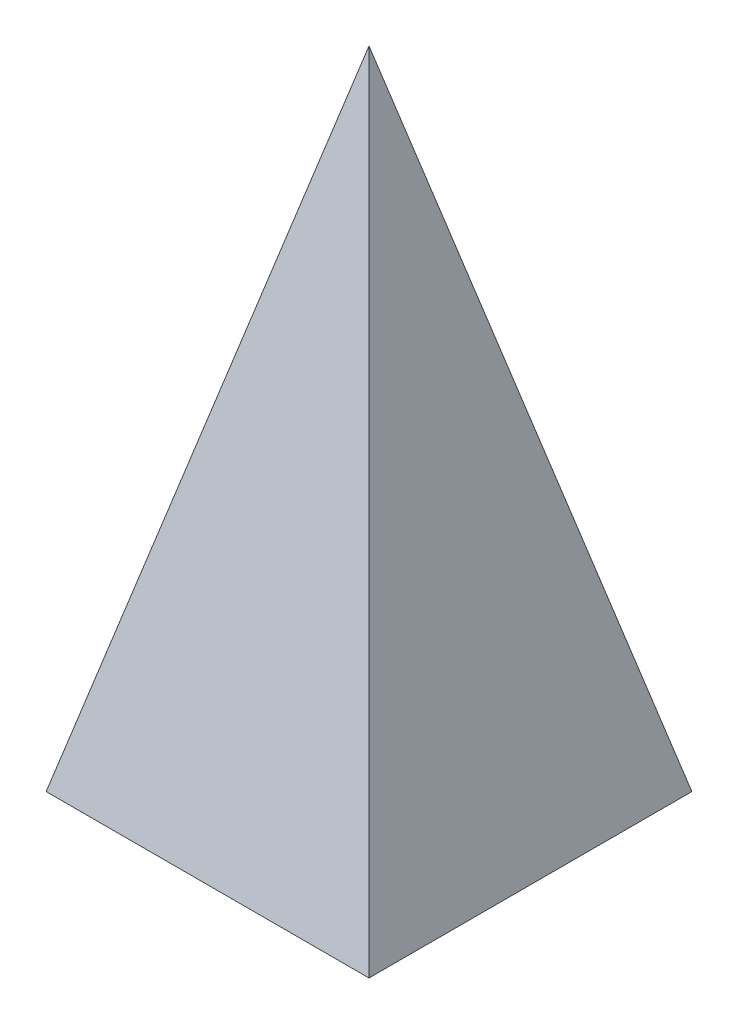
ISO-10303-21;
HEADER;
FILE_DESCRIPTION(('STEP AP214'),'2;1');
FILE_NAME('part.step','',(''),(''),'','','');
FILE_SCHEMA(('AUTOMOTIVE_DESIGN { 1 0 10303 214 1 1 1 1 }'));
ENDSEC;
DATA;
#1=APPLICATION_CONTEXT('core data for automotive mechanical design processes');
#2=APPLICATION_PROTOCOL_DEFINITION('international standard','automotive_design',2000,#1);
#3=PRODUCT_CONTEXT('',#1,'mechanical');
#4=PRODUCT('Part','Part','',(#3));
#5=PRODUCT_RELATED_PRODUCT_CATEGORY('part','',(#4));
#6=PRODUCT_DEFINITION_FORMATION('','',#4);
#7=PRODUCT_DEFINITION_CONTEXT('part definition',#1,'design');
#8=PRODUCT_DEFINITION('design','',#6,#7);
#9=PRODUCT_DEFINITION_SHAPE('','',#8);
#10=(LENGTH_UNIT() NAMED_UNIT(*) SI_UNIT(.MILLI.,.METRE.));
#11=(NAMED_UNIT(*) PLANE_ANGLE_UNIT() SI_UNIT($,.RADIAN.));
#12=(NAMED_UNIT(*) SI_UNIT($,.STERADIAN.) SOLID_ANGLE_UNIT());
#13=UNCERTAINTY_MEASURE_WITH_UNIT(LENGTH_MEASURE(1.E-05),#10,'distance_accuracy_value','');
#14=(GEOMETRIC_REPRESENTATION_CONTEXT(3) GLOBAL_UNCERTAINTY_ASSIGNED_CONTEXT((#13)) GLOBAL_UNIT_ASSIGNED_CONTEXT((#10,
#11,#12)) REPRESENTATION_CONTEXT('',''));
#15=CARTESIAN_POINT('',(0.,0.,0.));
#16=DIRECTION('',(0.,0.,1.));
#17=DIRECTION('',(1.,0.,0.));
#18=AXIS2_PLACEMENT_3D('',#15,#16,#17);
#19=CARTESIAN_POINT('',(0.,0.,0.));
#20=DIRECTION('',(0.,1.,0.));
#21=DIRECTION('',(0.,0.,1.));
#22=AXIS2_PLACEMENT_3D('',#19,#20,#21);
#23=PLANE('',#22);
#24=DIRECTION('',(0.,0.,-1.));
#25=VECTOR('',#24,1.);
#26=CARTESIAN_POINT('',(10.,0.,-10.));
#27=LINE('',#26,#25);
#28=CARTESIAN_POINT('',(10.,0.,10.));
#29=VERTEX_POINT('',#28);
#30=CARTESIAN_POINT('',(10.,0.,-10.));
#31=VERTEX_POINT('',#30);
#32=EDGE_CURVE('E137',#29,#31,#27,.T.);
#33=ORIENTED_EDGE('',*,*,#32,.F.);
#34=DIRECTION('',(1.,0.,0.));
#35=VECTOR('',#34,1.);
#36=CARTESIAN_POINT('',(-10.,0.,10.));
#37=LINE('',#36,#35);
#38=CARTESIAN_POINT('',(-10.,0.,10.));
#39=VERTEX_POINT('',#38);
#40=EDGE_CURVE('E74',#39,#29,#37,.T.);
#41=ORIENTED_EDGE('',*,*,#40,.F.);
#42=DIRECTION('',(0.,0.,1.));
#43=VECTOR('',#42,1.);
#44=CARTESIAN_POINT('',(-10.,0.,-10.));
#45=LINE('',#44,#43);
#46=CARTESIAN_POINT('',(-10.,0.,-10.));
#47=VERTEX_POINT('',#46);
#48=EDGE_CURVE('E67',#47,#39,#45,.T.);
#49=ORIENTED_EDGE('',*,*,#48,.F.);
#50=DIRECTION('',(-1.,0.,0.));
#51=VECTOR('',#50,1.);
#52=CARTESIAN_POINT('',(-10.,0.,-10.));
#53=LINE('',#52,#51);
#54=EDGE_CURVE('E91',#31,#47,#53,.T.);
#55=ORIENTED_EDGE('',*,*,#54,.F.);
#56=EDGE_LOOP('',(#33,#41,#49,#55));
#57=FACE_BOUND('',#56,.T.);
#58=ADVANCED_FACE('F47',(#57),#23,.F.);
#59=CARTESIAN_POINT('',(0.,2.35294117647059,-9.41176470588235));
#60=DIRECTION('',(0.,0.242535625036333,-0.970142500145332));
#61=DIRECTION('',(0.,0.970142500145332,0.242535625036333));
#62=AXIS2_PLACEMENT_3D('',#59,#60,#61);
#63=PLANE('',#62);
#64=DIRECTION('',(0.235702260395516,-0.942809041582063,-0.235702260395516));
#65=VECTOR('',#64,1.);
#66=CARTESIAN_POINT('',(0.,40.,0.));
#67=LINE('',#66,#65);
#68=CARTESIAN_POINT('',(0.,40.,0.));
#69=VERTEX_POINT('',#68);
#70=EDGE_CURVE('E89',#69,#31,#67,.T.);
#71=ORIENTED_EDGE('',*,*,#70,.T.);
#72=ORIENTED_EDGE('',*,*,#54,.T.);
#73=DIRECTION('',(-0.235702260395516,-0.942809041582063,-0.235702260395516));
#74=VECTOR('',#73,1.);
#75=CARTESIAN_POINT('',(0.,40.,0.));
#76=LINE('',#75,#74);
#77=EDGE_CURVE('E84',#69,#47,#76,.T.);
#78=ORIENTED_EDGE('',*,*,#77,.F.);
#79=EDGE_LOOP('',(#71,#72,#78));
#80=FACE_BOUND('',#79,.T.);
#81=ADVANCED_FACE('F93',(#80),#63,.T.);
#82=CARTESIAN_POINT('',(-9.41176470588236,2.35294117647059,0.));
#83=DIRECTION('',(-0.970142500145332,0.242535625036333,0.));
#84=DIRECTION('',(-0.242535625036333,-0.970142500145332,0.));
#85=AXIS2_PLACEMENT_3D('',#82,#83,#84);
#86=PLANE('',#85);
#87=ORIENTED_EDGE('',*,*,#77,.T.);
#88=ORIENTED_EDGE('',*,*,#48,.T.);
#89=DIRECTION('',(-0.235702260395516,-0.942809041582063,0.235702260395516));
#90=VECTOR('',#89,1.);
#91=CARTESIAN_POINT('',(0.,40.,0.));
#92=LINE('',#91,#90);
#93=EDGE_CURVE('E12',#69,#39,#92,.T.);
#94=ORIENTED_EDGE('',*,*,#93,.F.);
#95=EDGE_LOOP('',(#87,#88,#94));
#96=FACE_BOUND('',#95,.T.);
#97=ADVANCED_FACE('F86',(#96),#86,.T.);
#98=CARTESIAN_POINT('',(9.41176470588235,2.35294117647059,0.));
#99=DIRECTION('',(0.970142500145332,0.242535625036333,0.));
#100=DIRECTION('',(-0.242535625036333,0.970142500145332,0.));
#101=AXIS2_PLACEMENT_3D('',#98,#99,#100);
#102=PLANE('',#101);
#103=DIRECTION('',(0.235702260395516,-0.942809041582063,0.235702260395516));
#104=VECTOR('',#103,1.);
#105=CARTESIAN_POINT('',(0.,40.,0.));
#106=LINE('',#105,#104);
#107=EDGE_CURVE('E59',#69,#29,#106,.T.);
#108=ORIENTED_EDGE('',*,*,#107,.T.);
#109=ORIENTED_EDGE('',*,*,#32,.T.);
#110=ORIENTED_EDGE('',*,*,#70,.F.);
#111=EDGE_LOOP('',(#108,#109,#110));
#112=FACE_BOUND('',#111,.T.);
#113=ADVANCED_FACE('F142',(#112),#102,.T.);
#114=CARTESIAN_POINT('',(0.,2.35294117647059,9.41176470588235));
#115=DIRECTION('',(0.,0.242535625036333,0.970142500145332));
#116=DIRECTION('',(0.,-0.970142500145332,0.242535625036333));
#117=AXIS2_PLACEMENT_3D('',#114,#115,#116);
#118=PLANE('',#117);
#119=ORIENTED_EDGE('',*,*,#93,.T.);
#120=ORIENTED_EDGE('',*,*,#40,.T.);
#121=ORIENTED_EDGE('',*,*,#107,.F.);
#122=EDGE_LOOP('',(#119,#120,#121));
#123=FACE_BOUND('',#122,.T.);
#124=ADVANCED_FACE('F49',(#123),#118,.T.);
#125=CLOSED_SHELL('',(#58,#81,#97,#113,#124));
#126=MANIFOLD_SOLID_BREP('B2',#125);
#127=ADVANCED_BREP_SHAPE_REPRESENTATION('',(#18,#126),#14);
#128=SHAPE_DEFINITION_REPRESENTATION(#9,#127);
ENDSEC;
END-ISO-10303-21;
